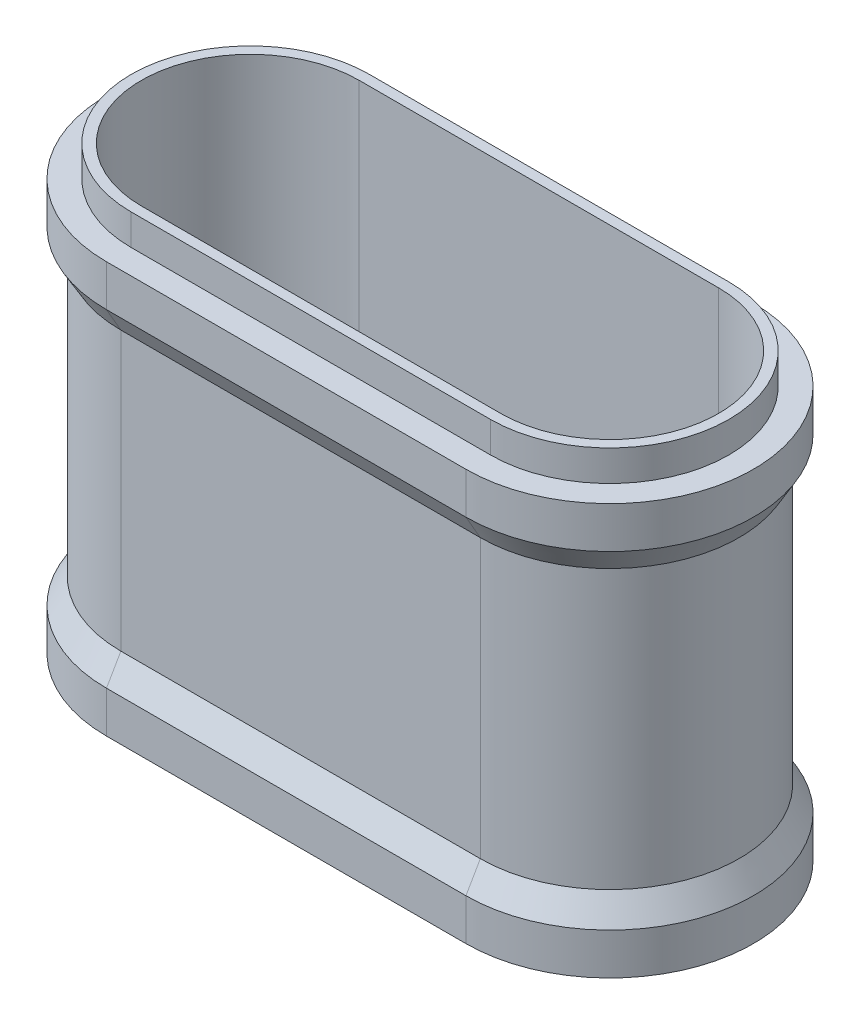
ISO-10303-21;
HEADER;
FILE_DESCRIPTION(('STEP AP214'),'2;1');
FILE_NAME('part.step','',(''),(''),'','','');
FILE_SCHEMA(('AUTOMOTIVE_DESIGN { 1 0 10303 214 1 1 1 1 }'));
ENDSEC;
DATA;
#1=APPLICATION_CONTEXT('core data for automotive mechanical design processes');
#2=APPLICATION_PROTOCOL_DEFINITION('international standard','automotive_design',2000,#1);
#3=PRODUCT_CONTEXT('',#1,'mechanical');
#4=PRODUCT('Part','Part','',(#3));
#5=PRODUCT_RELATED_PRODUCT_CATEGORY('part','',(#4));
#6=PRODUCT_DEFINITION_FORMATION('','',#4);
#7=PRODUCT_DEFINITION_CONTEXT('part definition',#1,'design');
#8=PRODUCT_DEFINITION('design','',#6,#7);
#9=PRODUCT_DEFINITION_SHAPE('','',#8);
#10=(LENGTH_UNIT() NAMED_UNIT(*) SI_UNIT(.MILLI.,.METRE.));
#11=(NAMED_UNIT(*) PLANE_ANGLE_UNIT() SI_UNIT($,.RADIAN.));
#12=(NAMED_UNIT(*) SI_UNIT($,.STERADIAN.) SOLID_ANGLE_UNIT());
#13=UNCERTAINTY_MEASURE_WITH_UNIT(LENGTH_MEASURE(1.E-05),#10,'distance_accuracy_value','');
#14=(GEOMETRIC_REPRESENTATION_CONTEXT(3) GLOBAL_UNCERTAINTY_ASSIGNED_CONTEXT((#13)) GLOBAL_UNIT_ASSIGNED_CONTEXT((#10,
#11,#12)) REPRESENTATION_CONTEXT('',''));
#15=CARTESIAN_POINT('',(0.,0.,0.));
#16=DIRECTION('',(0.,0.,1.));
#17=DIRECTION('',(1.,0.,0.));
#18=AXIS2_PLACEMENT_3D('',#15,#16,#17);
#19=CARTESIAN_POINT('',(-8.75,10.,0.));
#20=DIRECTION('',(0.,1.,0.));
#21=DIRECTION('',(0.,0.,1.));
#22=AXIS2_PLACEMENT_3D('',#19,#20,#21);
#23=PLANE('',#22);
#24=CARTESIAN_POINT('',(8.75,10.,0.));
#25=DIRECTION('',(0.,1.,0.));
#26=DIRECTION('',(0.,0.,1.));
#27=AXIS2_PLACEMENT_3D('',#24,#25,#26);
#28=CIRCLE('',#27,7.);
#29=CARTESIAN_POINT('',(8.75,10.,7.));
#30=VERTEX_POINT('',#29);
#31=CARTESIAN_POINT('',(8.75,10.,-7.));
#32=VERTEX_POINT('',#31);
#33=EDGE_CURVE('E257',#30,#32,#28,.T.);
#34=ORIENTED_EDGE('',*,*,#33,.T.);
#35=DIRECTION('',(-1.,0.,0.));
#36=VECTOR('',#35,1.);
#37=CARTESIAN_POINT('',(8.75,10.,-7.));
#38=LINE('',#37,#36);
#39=CARTESIAN_POINT('',(-8.75,10.,-7.));
#40=VERTEX_POINT('',#39);
#41=EDGE_CURVE('E268',#32,#40,#38,.T.);
#42=ORIENTED_EDGE('',*,*,#41,.T.);
#43=CARTESIAN_POINT('',(-8.75,10.,0.));
#44=DIRECTION('',(0.,1.,0.));
#45=DIRECTION('',(0.,0.,1.));
#46=AXIS2_PLACEMENT_3D('',#43,#44,#45);
#47=CIRCLE('',#46,7.);
#48=CARTESIAN_POINT('',(-8.75,10.,7.));
#49=VERTEX_POINT('',#48);
#50=EDGE_CURVE('E271',#40,#49,#47,.T.);
#51=ORIENTED_EDGE('',*,*,#50,.T.);
#52=DIRECTION('',(1.,0.,0.));
#53=VECTOR('',#52,1.);
#54=CARTESIAN_POINT('',(8.75,10.,7.));
#55=LINE('',#54,#53);
#56=EDGE_CURVE('E274',#49,#30,#55,.T.);
#57=ORIENTED_EDGE('',*,*,#56,.T.);
#58=EDGE_LOOP('',(#34,#42,#51,#57));
#59=FACE_BOUND('',#58,.T.);
#60=DIRECTION('',(1.,0.,0.));
#61=VECTOR('',#60,1.);
#62=CARTESIAN_POINT('',(-8.75,10.,5.8));
#63=LINE('',#62,#61);
#64=CARTESIAN_POINT('',(-8.75,10.,5.8));
#65=VERTEX_POINT('',#64);
#66=CARTESIAN_POINT('',(8.75,10.,5.8));
#67=VERTEX_POINT('',#66);
#68=EDGE_CURVE('E229',#65,#67,#63,.T.);
#69=ORIENTED_EDGE('',*,*,#68,.F.);
#70=CARTESIAN_POINT('',(-8.75,10.,0.));
#71=DIRECTION('',(0.,1.,0.));
#72=DIRECTION('',(0.,0.,1.));
#73=AXIS2_PLACEMENT_3D('',#70,#71,#72);
#74=CIRCLE('',#73,5.8);
#75=CARTESIAN_POINT('',(-8.75,10.,-5.8));
#76=VERTEX_POINT('',#75);
#77=EDGE_CURVE('E215',#76,#65,#74,.T.);
#78=ORIENTED_EDGE('',*,*,#77,.F.);
#79=DIRECTION('',(-1.,0.,0.));
#80=VECTOR('',#79,1.);
#81=CARTESIAN_POINT('',(8.74999999999999,10.,-5.8));
#82=LINE('',#81,#80);
#83=CARTESIAN_POINT('',(8.74999999999999,10.,-5.8));
#84=VERTEX_POINT('',#83);
#85=EDGE_CURVE('E220',#84,#76,#82,.T.);
#86=ORIENTED_EDGE('',*,*,#85,.F.);
#87=CARTESIAN_POINT('',(8.75,10.,0.));
#88=DIRECTION('',(0.,1.,0.));
#89=DIRECTION('',(0.,0.,1.));
#90=AXIS2_PLACEMENT_3D('',#87,#88,#89);
#91=CIRCLE('',#90,5.8);
#92=EDGE_CURVE('E231',#67,#84,#91,.T.);
#93=ORIENTED_EDGE('',*,*,#92,.F.);
#94=EDGE_LOOP('',(#69,#78,#86,#93));
#95=FACE_BOUND('',#94,.T.);
#96=ADVANCED_FACE('F45',(#59,#95),#23,.T.);
#97=CARTESIAN_POINT('',(-8.75,-10.,0.));
#98=DIRECTION('',(0.,1.,0.));
#99=DIRECTION('',(0.,0.,1.));
#100=AXIS2_PLACEMENT_3D('',#97,#98,#99);
#101=CYLINDRICAL_SURFACE('',#100,6.3);
#102=DIRECTION('',(0.,1.,0.));
#103=VECTOR('',#102,1.);
#104=CARTESIAN_POINT('',(-8.75,-10.,-6.3));
#105=LINE('',#104,#103);
#106=CARTESIAN_POINT('',(-8.75,-6.76794919243109,-6.3));
#107=VERTEX_POINT('',#106);
#108=CARTESIAN_POINT('',(-8.75,6.76794919243109,-6.3));
#109=VERTEX_POINT('',#108);
#110=EDGE_CURVE('E297',#107,#109,#105,.T.);
#111=ORIENTED_EDGE('',*,*,#110,.F.);
#112=CARTESIAN_POINT('',(-8.75,-6.76794919243109,0.));
#113=DIRECTION('',(0.,-1.,0.));
#114=DIRECTION('',(0.,0.,-1.));
#115=AXIS2_PLACEMENT_3D('',#112,#113,#114);
#116=CIRCLE('',#115,6.3);
#117=CARTESIAN_POINT('',(-8.75,-6.76794919243109,6.3));
#118=VERTEX_POINT('',#117);
#119=EDGE_CURVE('E324',#107,#118,#116,.F.);
#120=ORIENTED_EDGE('',*,*,#119,.T.);
#121=DIRECTION('',(0.,1.,0.));
#122=VECTOR('',#121,1.);
#123=CARTESIAN_POINT('',(-8.75,-10.,6.3));
#124=LINE('',#123,#122);
#125=CARTESIAN_POINT('',(-8.75,6.76794919243109,6.3));
#126=VERTEX_POINT('',#125);
#127=EDGE_CURVE('E293',#118,#126,#124,.T.);
#128=ORIENTED_EDGE('',*,*,#127,.T.);
#129=CARTESIAN_POINT('',(-8.75,6.76794919243109,0.));
#130=DIRECTION('',(0.,1.,0.));
#131=DIRECTION('',(0.,0.,1.));
#132=AXIS2_PLACEMENT_3D('',#129,#130,#131);
#133=CIRCLE('',#132,6.3);
#134=EDGE_CURVE('E322',#126,#109,#133,.F.);
#135=ORIENTED_EDGE('',*,*,#134,.T.);
#136=EDGE_LOOP('',(#111,#120,#128,#135));
#137=FACE_BOUND('',#136,.T.);
#138=ADVANCED_FACE('F409',(#137),#101,.T.);
#139=CARTESIAN_POINT('',(-8.75,-10.,-6.3));
#140=DIRECTION('',(0.,0.,-1.));
#141=DIRECTION('',(-1.,0.,0.));
#142=AXIS2_PLACEMENT_3D('',#139,#140,#141);
#143=PLANE('',#142);
#144=DIRECTION('',(0.,1.,0.));
#145=VECTOR('',#144,1.);
#146=CARTESIAN_POINT('',(8.75,-10.,-6.3));
#147=LINE('',#146,#145);
#148=CARTESIAN_POINT('',(8.75,-6.76794919243109,-6.3));
#149=VERTEX_POINT('',#148);
#150=CARTESIAN_POINT('',(8.75,6.76794919243109,-6.3));
#151=VERTEX_POINT('',#150);
#152=EDGE_CURVE('E301',#149,#151,#147,.T.);
#153=ORIENTED_EDGE('',*,*,#152,.F.);
#154=DIRECTION('',(-1.,0.,0.));
#155=VECTOR('',#154,1.);
#156=CARTESIAN_POINT('',(-8.75,-6.76794919243109,-6.3));
#157=LINE('',#156,#155);
#158=EDGE_CURVE('E316',#149,#107,#157,.T.);
#159=ORIENTED_EDGE('',*,*,#158,.T.);
#160=ORIENTED_EDGE('',*,*,#110,.T.);
#161=DIRECTION('',(1.,0.,0.));
#162=VECTOR('',#161,1.);
#163=CARTESIAN_POINT('',(-8.75,6.76794919243109,-6.3));
#164=LINE('',#163,#162);
#165=EDGE_CURVE('E313',#109,#151,#164,.T.);
#166=ORIENTED_EDGE('',*,*,#165,.T.);
#167=EDGE_LOOP('',(#153,#159,#160,#166));
#168=FACE_BOUND('',#167,.T.);
#169=ADVANCED_FACE('F390',(#168),#143,.T.);
#170=CARTESIAN_POINT('',(8.75,-10.,0.));
#171=DIRECTION('',(0.,1.,0.));
#172=DIRECTION('',(0.,0.,1.));
#173=AXIS2_PLACEMENT_3D('',#170,#171,#172);
#174=CYLINDRICAL_SURFACE('',#173,6.3);
#175=DIRECTION('',(0.,1.,0.));
#176=VECTOR('',#175,1.);
#177=CARTESIAN_POINT('',(8.75,-10.,6.29999999999999));
#178=LINE('',#177,#176);
#179=CARTESIAN_POINT('',(8.75,-6.76794919243109,6.29999999999999));
#180=VERTEX_POINT('',#179);
#181=CARTESIAN_POINT('',(8.75,6.76794919243109,6.29999999999999));
#182=VERTEX_POINT('',#181);
#183=EDGE_CURVE('E304',#180,#182,#178,.T.);
#184=ORIENTED_EDGE('',*,*,#183,.F.);
#185=CARTESIAN_POINT('',(8.75,-6.76794919243109,0.));
#186=DIRECTION('',(0.,-1.,0.));
#187=DIRECTION('',(0.,0.,-1.));
#188=AXIS2_PLACEMENT_3D('',#185,#186,#187);
#189=CIRCLE('',#188,6.3);
#190=EDGE_CURVE('E310',#180,#149,#189,.F.);
#191=ORIENTED_EDGE('',*,*,#190,.T.);
#192=ORIENTED_EDGE('',*,*,#152,.T.);
#193=CARTESIAN_POINT('',(8.75,6.76794919243109,0.));
#194=DIRECTION('',(0.,1.,0.));
#195=DIRECTION('',(0.,0.,1.));
#196=AXIS2_PLACEMENT_3D('',#193,#194,#195);
#197=CIRCLE('',#196,6.3);
#198=EDGE_CURVE('E300',#151,#182,#197,.F.);
#199=ORIENTED_EDGE('',*,*,#198,.T.);
#200=EDGE_LOOP('',(#184,#191,#192,#199));
#201=FACE_BOUND('',#200,.T.);
#202=ADVANCED_FACE('F394',(#201),#174,.T.);
#203=CARTESIAN_POINT('',(-8.75,-10.,6.3));
#204=DIRECTION('',(0.,0.,1.));
#205=DIRECTION('',(1.,0.,0.));
#206=AXIS2_PLACEMENT_3D('',#203,#204,#205);
#207=PLANE('',#206);
#208=ORIENTED_EDGE('',*,*,#127,.F.);
#209=DIRECTION('',(1.,0.,0.));
#210=VECTOR('',#209,1.);
#211=CARTESIAN_POINT('',(-8.75,-6.76794919243109,6.3));
#212=LINE('',#211,#210);
#213=EDGE_CURVE('E320',#118,#180,#212,.T.);
#214=ORIENTED_EDGE('',*,*,#213,.T.);
#215=ORIENTED_EDGE('',*,*,#183,.T.);
#216=DIRECTION('',(-1.,0.,0.));
#217=VECTOR('',#216,1.);
#218=CARTESIAN_POINT('',(-8.75,6.76794919243109,6.3));
#219=LINE('',#218,#217);
#220=EDGE_CURVE('E318',#182,#126,#219,.T.);
#221=ORIENTED_EDGE('',*,*,#220,.T.);
#222=EDGE_LOOP('',(#208,#214,#215,#221));
#223=FACE_BOUND('',#222,.T.);
#224=ADVANCED_FACE('F419',(#223),#207,.T.);
#225=CARTESIAN_POINT('',(-8.75,-10.,0.));
#226=DIRECTION('',(0.,1.,0.));
#227=DIRECTION('',(0.,0.,1.));
#228=AXIS2_PLACEMENT_3D('',#225,#226,#227);
#229=PLANE('',#228);
#230=DIRECTION('',(-1.,0.,0.));
#231=VECTOR('',#230,1.);
#232=CARTESIAN_POINT('',(-8.75,-10.,-5.3));
#233=LINE('',#232,#231);
#234=CARTESIAN_POINT('',(8.75,-10.,-5.3));
#235=VERTEX_POINT('',#234);
#236=CARTESIAN_POINT('',(-8.75,-10.,-5.3));
#237=VERTEX_POINT('',#236);
#238=EDGE_CURVE('E192',#235,#237,#233,.T.);
#239=ORIENTED_EDGE('',*,*,#238,.T.);
#240=CARTESIAN_POINT('',(-8.75,-10.,0.));
#241=DIRECTION('',(0.,1.,0.));
#242=DIRECTION('',(0.,0.,1.));
#243=AXIS2_PLACEMENT_3D('',#240,#241,#242);
#244=CIRCLE('',#243,5.3);
#245=CARTESIAN_POINT('',(-8.75,-10.,5.3));
#246=VERTEX_POINT('',#245);
#247=EDGE_CURVE('E279',#237,#246,#244,.T.);
#248=ORIENTED_EDGE('',*,*,#247,.T.);
#249=DIRECTION('',(1.,0.,0.));
#250=VECTOR('',#249,1.);
#251=CARTESIAN_POINT('',(-8.75,-10.,5.3));
#252=LINE('',#251,#250);
#253=CARTESIAN_POINT('',(8.75,-10.,5.3));
#254=VERTEX_POINT('',#253);
#255=EDGE_CURVE('E286',#246,#254,#252,.T.);
#256=ORIENTED_EDGE('',*,*,#255,.T.);
#257=CARTESIAN_POINT('',(8.75,-10.,0.));
#258=DIRECTION('',(0.,1.,0.));
#259=DIRECTION('',(0.,0.,1.));
#260=AXIS2_PLACEMENT_3D('',#257,#258,#259);
#261=CIRCLE('',#260,5.3);
#262=EDGE_CURVE('E289',#254,#235,#261,.T.);
#263=ORIENTED_EDGE('',*,*,#262,.T.);
#264=EDGE_LOOP('',(#239,#248,#256,#263));
#265=FACE_BOUND('',#264,.T.);
#266=CARTESIAN_POINT('',(8.75,-10.,0.));
#267=DIRECTION('',(0.,1.,0.));
#268=DIRECTION('',(0.,0.,1.));
#269=AXIS2_PLACEMENT_3D('',#266,#267,#268);
#270=CIRCLE('',#269,7.);
#271=CARTESIAN_POINT('',(8.75,-10.,7.));
#272=VERTEX_POINT('',#271);
#273=CARTESIAN_POINT('',(8.75,-10.,-7.));
#274=VERTEX_POINT('',#273);
#275=EDGE_CURVE('E244',#272,#274,#270,.T.);
#276=ORIENTED_EDGE('',*,*,#275,.F.);
#277=DIRECTION('',(1.,0.,0.));
#278=VECTOR('',#277,1.);
#279=CARTESIAN_POINT('',(8.75,-10.,7.));
#280=LINE('',#279,#278);
#281=CARTESIAN_POINT('',(-8.75,-10.,7.));
#282=VERTEX_POINT('',#281);
#283=EDGE_CURVE('E247',#282,#272,#280,.T.);
#284=ORIENTED_EDGE('',*,*,#283,.F.);
#285=CARTESIAN_POINT('',(-8.75,-10.,0.));
#286=DIRECTION('',(0.,1.,0.));
#287=DIRECTION('',(0.,0.,1.));
#288=AXIS2_PLACEMENT_3D('',#285,#286,#287);
#289=CIRCLE('',#288,7.);
#290=CARTESIAN_POINT('',(-8.75,-10.,-7.));
#291=VERTEX_POINT('',#290);
#292=EDGE_CURVE('E249',#291,#282,#289,.T.);
#293=ORIENTED_EDGE('',*,*,#292,.F.);
#294=DIRECTION('',(-1.,0.,0.));
#295=VECTOR('',#294,1.);
#296=CARTESIAN_POINT('',(8.75,-10.,-7.));
#297=LINE('',#296,#295);
#298=EDGE_CURVE('E251',#274,#291,#297,.T.);
#299=ORIENTED_EDGE('',*,*,#298,.F.);
#300=EDGE_LOOP('',(#276,#284,#293,#299));
#301=FACE_BOUND('',#300,.T.);
#302=ADVANCED_FACE('F421',(#265,#301),#229,.F.);
#303=CARTESIAN_POINT('',(-8.75,-10.,0.));
#304=DIRECTION('',(0.,1.,0.));
#305=DIRECTION('',(0.,0.,1.));
#306=AXIS2_PLACEMENT_3D('',#303,#304,#305);
#307=CYLINDRICAL_SURFACE('',#306,5.3);
#308=DIRECTION('',(0.,1.,0.));
#309=VECTOR('',#308,1.);
#310=CARTESIAN_POINT('',(-8.75,-10.,-5.3));
#311=LINE('',#310,#309);
#312=CARTESIAN_POINT('',(-8.75,11.5,-5.3));
#313=VERTEX_POINT('',#312);
#314=EDGE_CURVE('E195',#237,#313,#311,.T.);
#315=ORIENTED_EDGE('',*,*,#314,.T.);
#316=CARTESIAN_POINT('',(-8.75,11.5,0.));
#317=DIRECTION('',(0.,1.,0.));
#318=DIRECTION('',(0.,0.,1.));
#319=AXIS2_PLACEMENT_3D('',#316,#317,#318);
#320=CIRCLE('',#319,5.3);
#321=CARTESIAN_POINT('',(-8.75,11.5,5.3));
#322=VERTEX_POINT('',#321);
#323=EDGE_CURVE('E209',#313,#322,#320,.T.);
#324=ORIENTED_EDGE('',*,*,#323,.T.);
#325=DIRECTION('',(0.,1.,0.));
#326=VECTOR('',#325,1.);
#327=CARTESIAN_POINT('',(-8.75,-10.,5.3));
#328=LINE('',#327,#326);
#329=EDGE_CURVE('E292',#246,#322,#328,.T.);
#330=ORIENTED_EDGE('',*,*,#329,.F.);
#331=ORIENTED_EDGE('',*,*,#247,.F.);
#332=EDGE_LOOP('',(#315,#324,#330,#331));
#333=FACE_BOUND('',#332,.T.);
#334=ADVANCED_FACE('F428',(#333),#307,.F.);
#335=CARTESIAN_POINT('',(-8.75,-10.,-5.3));
#336=DIRECTION('',(0.,0.,-1.));
#337=DIRECTION('',(-1.,0.,0.));
#338=AXIS2_PLACEMENT_3D('',#335,#336,#337);
#339=PLANE('',#338);
#340=DIRECTION('',(0.,1.,0.));
#341=VECTOR('',#340,1.);
#342=CARTESIAN_POINT('',(8.75,-10.,-5.3));
#343=LINE('',#342,#341);
#344=CARTESIAN_POINT('',(8.74999999999999,11.5,-5.3));
#345=VERTEX_POINT('',#344);
#346=EDGE_CURVE('E185',#235,#345,#343,.T.);
#347=ORIENTED_EDGE('',*,*,#346,.T.);
#348=DIRECTION('',(-1.,0.,0.));
#349=VECTOR('',#348,1.);
#350=CARTESIAN_POINT('',(8.74999999999999,11.5,-5.3));
#351=LINE('',#350,#349);
#352=EDGE_CURVE('E189',#345,#313,#351,.T.);
#353=ORIENTED_EDGE('',*,*,#352,.T.);
#354=ORIENTED_EDGE('',*,*,#314,.F.);
#355=ORIENTED_EDGE('',*,*,#238,.F.);
#356=EDGE_LOOP('',(#347,#353,#354,#355));
#357=FACE_BOUND('',#356,.T.);
#358=ADVANCED_FACE('F187',(#357),#339,.F.);
#359=CARTESIAN_POINT('',(8.75,-10.,0.));
#360=DIRECTION('',(0.,1.,0.));
#361=DIRECTION('',(0.,0.,1.));
#362=AXIS2_PLACEMENT_3D('',#359,#360,#361);
#363=CYLINDRICAL_SURFACE('',#362,5.3);
#364=DIRECTION('',(0.,1.,0.));
#365=VECTOR('',#364,1.);
#366=CARTESIAN_POINT('',(8.75,-10.,5.3));
#367=LINE('',#366,#365);
#368=CARTESIAN_POINT('',(8.75,11.5,5.3));
#369=VERTEX_POINT('',#368);
#370=EDGE_CURVE('E196',#254,#369,#367,.T.);
#371=ORIENTED_EDGE('',*,*,#370,.T.);
#372=CARTESIAN_POINT('',(8.75,11.5,0.));
#373=DIRECTION('',(0.,1.,0.));
#374=DIRECTION('',(0.,0.,1.));
#375=AXIS2_PLACEMENT_3D('',#372,#373,#374);
#376=CIRCLE('',#375,5.3);
#377=EDGE_CURVE('E199',#369,#345,#376,.T.);
#378=ORIENTED_EDGE('',*,*,#377,.T.);
#379=ORIENTED_EDGE('',*,*,#346,.F.);
#380=ORIENTED_EDGE('',*,*,#262,.F.);
#381=EDGE_LOOP('',(#371,#378,#379,#380));
#382=FACE_BOUND('',#381,.T.);
#383=ADVANCED_FACE('F200',(#382),#363,.F.);
#384=CARTESIAN_POINT('',(-8.75,-10.,5.3));
#385=DIRECTION('',(0.,0.,1.));
#386=DIRECTION('',(1.,0.,0.));
#387=AXIS2_PLACEMENT_3D('',#384,#385,#386);
#388=PLANE('',#387);
#389=ORIENTED_EDGE('',*,*,#329,.T.);
#390=DIRECTION('',(1.,0.,0.));
#391=VECTOR('',#390,1.);
#392=CARTESIAN_POINT('',(-8.75,11.5,5.3));
#393=LINE('',#392,#391);
#394=EDGE_CURVE('E211',#322,#369,#393,.T.);
#395=ORIENTED_EDGE('',*,*,#394,.T.);
#396=ORIENTED_EDGE('',*,*,#370,.F.);
#397=ORIENTED_EDGE('',*,*,#255,.F.);
#398=EDGE_LOOP('',(#389,#395,#396,#397));
#399=FACE_BOUND('',#398,.T.);
#400=ADVANCED_FACE('F446',(#399),#388,.F.);
#401=CARTESIAN_POINT('',(8.75,8.5,0.));
#402=DIRECTION('',(0.,1.,0.));
#403=DIRECTION('',(0.,0.,1.));
#404=AXIS2_PLACEMENT_3D('',#401,#402,#403);
#405=CYLINDRICAL_SURFACE('',#404,7.);
#406=ORIENTED_EDGE('',*,*,#33,.F.);
#407=DIRECTION('',(0.,1.,0.));
#408=VECTOR('',#407,1.);
#409=CARTESIAN_POINT('',(8.75,8.5,7.));
#410=LINE('',#409,#408);
#411=CARTESIAN_POINT('',(8.75,7.98038475772931,6.99999999999999));
#412=VERTEX_POINT('',#411);
#413=EDGE_CURVE('E63',#412,#30,#410,.T.);
#414=ORIENTED_EDGE('',*,*,#413,.F.);
#415=CARTESIAN_POINT('',(8.75,7.98038475772931,0.));
#416=DIRECTION('',(0.,1.,0.));
#417=DIRECTION('',(0.,0.,1.));
#418=AXIS2_PLACEMENT_3D('',#415,#416,#417);
#419=CIRCLE('',#418,7.);
#420=CARTESIAN_POINT('',(8.75,7.98038475772931,-7.));
#421=VERTEX_POINT('',#420);
#422=EDGE_CURVE('E341',#412,#421,#419,.T.);
#423=ORIENTED_EDGE('',*,*,#422,.T.);
#424=DIRECTION('',(0.,1.,0.));
#425=VECTOR('',#424,1.);
#426=CARTESIAN_POINT('',(8.75,8.5,-7.));
#427=LINE('',#426,#425);
#428=EDGE_CURVE('E277',#421,#32,#427,.T.);
#429=ORIENTED_EDGE('',*,*,#428,.T.);
#430=EDGE_LOOP('',(#406,#414,#423,#429));
#431=FACE_BOUND('',#430,.T.);
#432=ADVANCED_FACE('F375',(#431),#405,.T.);
#433=CARTESIAN_POINT('',(8.75,8.5,7.));
#434=DIRECTION('',(0.,0.,1.));
#435=DIRECTION('',(1.,0.,0.));
#436=AXIS2_PLACEMENT_3D('',#433,#434,#435);
#437=PLANE('',#436);
#438=ORIENTED_EDGE('',*,*,#56,.F.);
#439=DIRECTION('',(0.,1.,0.));
#440=VECTOR('',#439,1.);
#441=CARTESIAN_POINT('',(-8.75,8.5,7.));
#442=LINE('',#441,#440);
#443=CARTESIAN_POINT('',(-8.75,7.98038475772932,7.));
#444=VERTEX_POINT('',#443);
#445=EDGE_CURVE('E69',#444,#49,#442,.T.);
#446=ORIENTED_EDGE('',*,*,#445,.F.);
#447=DIRECTION('',(1.,0.,0.));
#448=VECTOR('',#447,1.);
#449=CARTESIAN_POINT('',(-8.75,7.98038475772932,7.));
#450=LINE('',#449,#448);
#451=EDGE_CURVE('E11',#444,#412,#450,.T.);
#452=ORIENTED_EDGE('',*,*,#451,.T.);
#453=ORIENTED_EDGE('',*,*,#413,.T.);
#454=EDGE_LOOP('',(#438,#446,#452,#453));
#455=FACE_BOUND('',#454,.T.);
#456=ADVANCED_FACE('F374',(#455),#437,.T.);
#457=CARTESIAN_POINT('',(-8.75,8.5,0.));
#458=DIRECTION('',(0.,1.,0.));
#459=DIRECTION('',(0.,0.,1.));
#460=AXIS2_PLACEMENT_3D('',#457,#458,#459);
#461=CYLINDRICAL_SURFACE('',#460,7.);
#462=ORIENTED_EDGE('',*,*,#50,.F.);
#463=DIRECTION('',(0.,1.,0.));
#464=VECTOR('',#463,1.);
#465=CARTESIAN_POINT('',(-8.75,8.5,-7.));
#466=LINE('',#465,#464);
#467=CARTESIAN_POINT('',(-8.75,7.98038475772931,-7.));
#468=VERTEX_POINT('',#467);
#469=EDGE_CURVE('E281',#468,#40,#466,.T.);
#470=ORIENTED_EDGE('',*,*,#469,.F.);
#471=CARTESIAN_POINT('',(-8.75,7.98038475772931,0.));
#472=DIRECTION('',(0.,1.,0.));
#473=DIRECTION('',(0.,0.,1.));
#474=AXIS2_PLACEMENT_3D('',#471,#472,#473);
#475=CIRCLE('',#474,7.);
#476=EDGE_CURVE('E55',#468,#444,#475,.T.);
#477=ORIENTED_EDGE('',*,*,#476,.T.);
#478=ORIENTED_EDGE('',*,*,#445,.T.);
#479=EDGE_LOOP('',(#462,#470,#477,#478));
#480=FACE_BOUND('',#479,.T.);
#481=ADVANCED_FACE('F381',(#480),#461,.T.);
#482=CARTESIAN_POINT('',(8.75,8.5,-7.));
#483=DIRECTION('',(0.,0.,-1.));
#484=DIRECTION('',(-1.,0.,0.));
#485=AXIS2_PLACEMENT_3D('',#482,#483,#484);
#486=PLANE('',#485);
#487=ORIENTED_EDGE('',*,*,#428,.F.);
#488=DIRECTION('',(-1.,0.,0.));
#489=VECTOR('',#488,1.);
#490=CARTESIAN_POINT('',(-8.75,7.98038475772931,-7.));
#491=LINE('',#490,#489);
#492=EDGE_CURVE('E338',#421,#468,#491,.T.);
#493=ORIENTED_EDGE('',*,*,#492,.T.);
#494=ORIENTED_EDGE('',*,*,#469,.T.);
#495=ORIENTED_EDGE('',*,*,#41,.F.);
#496=EDGE_LOOP('',(#487,#493,#494,#495));
#497=FACE_BOUND('',#496,.T.);
#498=ADVANCED_FACE('F473',(#497),#486,.T.);
#499=CARTESIAN_POINT('',(8.75,-8.5,0.));
#500=DIRECTION('',(0.,-1.,0.));
#501=DIRECTION('',(0.,0.,-1.));
#502=AXIS2_PLACEMENT_3D('',#499,#500,#501);
#503=CYLINDRICAL_SURFACE('',#502,7.);
#504=ORIENTED_EDGE('',*,*,#275,.T.);
#505=DIRECTION('',(0.,-1.,0.));
#506=VECTOR('',#505,1.);
#507=CARTESIAN_POINT('',(8.75,-8.5,-7.));
#508=LINE('',#507,#506);
#509=CARTESIAN_POINT('',(8.74999999999999,-7.98038475772932,-7.00000000000001));
#510=VERTEX_POINT('',#509);
#511=EDGE_CURVE('E254',#510,#274,#508,.T.);
#512=ORIENTED_EDGE('',*,*,#511,.F.);
#513=CARTESIAN_POINT('',(8.75,-7.98038475772931,0.));
#514=DIRECTION('',(0.,-1.,0.));
#515=DIRECTION('',(0.,0.,-1.));
#516=AXIS2_PLACEMENT_3D('',#513,#514,#515);
#517=CIRCLE('',#516,7.);
#518=CARTESIAN_POINT('',(8.75,-7.98038475772931,7.));
#519=VERTEX_POINT('',#518);
#520=EDGE_CURVE('E326',#510,#519,#517,.T.);
#521=ORIENTED_EDGE('',*,*,#520,.T.);
#522=DIRECTION('',(0.,-1.,0.));
#523=VECTOR('',#522,1.);
#524=CARTESIAN_POINT('',(8.75,-8.5,7.));
#525=LINE('',#524,#523);
#526=EDGE_CURVE('E253',#519,#272,#525,.T.);
#527=ORIENTED_EDGE('',*,*,#526,.T.);
#528=EDGE_LOOP('',(#504,#512,#521,#527));
#529=FACE_BOUND('',#528,.T.);
#530=ADVANCED_FACE('F478',(#529),#503,.T.);
#531=CARTESIAN_POINT('',(8.75,-8.5,-7.));
#532=DIRECTION('',(0.,0.,1.));
#533=DIRECTION('',(1.,0.,0.));
#534=AXIS2_PLACEMENT_3D('',#531,#532,#533);
#535=PLANE('',#534);
#536=ORIENTED_EDGE('',*,*,#298,.T.);
#537=DIRECTION('',(0.,-1.,0.));
#538=VECTOR('',#537,1.);
#539=CARTESIAN_POINT('',(-8.75,-8.5,-7.));
#540=LINE('',#539,#538);
#541=CARTESIAN_POINT('',(-8.75,-7.98038475772931,-7.));
#542=VERTEX_POINT('',#541);
#543=EDGE_CURVE('E258',#542,#291,#540,.T.);
#544=ORIENTED_EDGE('',*,*,#543,.F.);
#545=DIRECTION('',(1.,0.,0.));
#546=VECTOR('',#545,1.);
#547=CARTESIAN_POINT('',(8.75,-7.98038475772932,-7.));
#548=LINE('',#547,#546);
#549=EDGE_CURVE('E329',#542,#510,#548,.T.);
#550=ORIENTED_EDGE('',*,*,#549,.T.);
#551=ORIENTED_EDGE('',*,*,#511,.T.);
#552=EDGE_LOOP('',(#536,#544,#550,#551));
#553=FACE_BOUND('',#552,.T.);
#554=ADVANCED_FACE('F554',(#553),#535,.F.);
#555=CARTESIAN_POINT('',(-8.75,-8.5,0.));
#556=DIRECTION('',(0.,-1.,0.));
#557=DIRECTION('',(0.,0.,-1.));
#558=AXIS2_PLACEMENT_3D('',#555,#556,#557);
#559=CYLINDRICAL_SURFACE('',#558,7.);
#560=ORIENTED_EDGE('',*,*,#292,.T.);
#561=DIRECTION('',(0.,-1.,0.));
#562=VECTOR('',#561,1.);
#563=CARTESIAN_POINT('',(-8.75,-8.5,7.));
#564=LINE('',#563,#562);
#565=CARTESIAN_POINT('',(-8.75,-7.98038475772931,7.));
#566=VERTEX_POINT('',#565);
#567=EDGE_CURVE('E261',#566,#282,#564,.T.);
#568=ORIENTED_EDGE('',*,*,#567,.F.);
#569=CARTESIAN_POINT('',(-8.75,-7.98038475772931,0.));
#570=DIRECTION('',(0.,-1.,0.));
#571=DIRECTION('',(0.,0.,-1.));
#572=AXIS2_PLACEMENT_3D('',#569,#570,#571);
#573=CIRCLE('',#572,7.);
#574=EDGE_CURVE('E335',#566,#542,#573,.T.);
#575=ORIENTED_EDGE('',*,*,#574,.T.);
#576=ORIENTED_EDGE('',*,*,#543,.T.);
#577=EDGE_LOOP('',(#560,#568,#575,#576));
#578=FACE_BOUND('',#577,.T.);
#579=ADVANCED_FACE('F564',(#578),#559,.T.);
#580=CARTESIAN_POINT('',(8.75,-8.5,7.));
#581=DIRECTION('',(0.,0.,-1.));
#582=DIRECTION('',(-1.,0.,0.));
#583=AXIS2_PLACEMENT_3D('',#580,#581,#582);
#584=PLANE('',#583);
#585=ORIENTED_EDGE('',*,*,#283,.T.);
#586=ORIENTED_EDGE('',*,*,#526,.F.);
#587=DIRECTION('',(-1.,0.,0.));
#588=VECTOR('',#587,1.);
#589=CARTESIAN_POINT('',(8.75,-7.98038475772931,7.));
#590=LINE('',#589,#588);
#591=EDGE_CURVE('E332',#519,#566,#590,.T.);
#592=ORIENTED_EDGE('',*,*,#591,.T.);
#593=ORIENTED_EDGE('',*,*,#567,.T.);
#594=EDGE_LOOP('',(#585,#586,#592,#593));
#595=FACE_BOUND('',#594,.T.);
#596=ADVANCED_FACE('F574',(#595),#584,.F.);
#597=CARTESIAN_POINT('',(-8.75,11.5,0.));
#598=DIRECTION('',(0.,1.,0.));
#599=DIRECTION('',(0.,0.,1.));
#600=AXIS2_PLACEMENT_3D('',#597,#598,#599);
#601=PLANE('',#600);
#602=CARTESIAN_POINT('',(-8.75,11.5,0.));
#603=DIRECTION('',(0.,1.,0.));
#604=DIRECTION('',(0.,0.,1.));
#605=AXIS2_PLACEMENT_3D('',#602,#603,#604);
#606=CIRCLE('',#605,5.8);
#607=CARTESIAN_POINT('',(-8.75,11.5,-5.8));
#608=VERTEX_POINT('',#607);
#609=CARTESIAN_POINT('',(-8.75,11.5,5.8));
#610=VERTEX_POINT('',#609);
#611=EDGE_CURVE('E216',#608,#610,#606,.T.);
#612=ORIENTED_EDGE('',*,*,#611,.T.);
#613=DIRECTION('',(1.,0.,0.));
#614=VECTOR('',#613,1.);
#615=CARTESIAN_POINT('',(-8.75,11.5,5.8));
#616=LINE('',#615,#614);
#617=CARTESIAN_POINT('',(8.75,11.5,5.8));
#618=VERTEX_POINT('',#617);
#619=EDGE_CURVE('E219',#610,#618,#616,.T.);
#620=ORIENTED_EDGE('',*,*,#619,.T.);
#621=CARTESIAN_POINT('',(8.75,11.5,0.));
#622=DIRECTION('',(0.,1.,0.));
#623=DIRECTION('',(0.,0.,1.));
#624=AXIS2_PLACEMENT_3D('',#621,#622,#623);
#625=CIRCLE('',#624,5.8);
#626=CARTESIAN_POINT('',(8.75,11.5,-5.8));
#627=VERTEX_POINT('',#626);
#628=EDGE_CURVE('E222',#618,#627,#625,.T.);
#629=ORIENTED_EDGE('',*,*,#628,.T.);
#630=DIRECTION('',(-1.,0.,0.));
#631=VECTOR('',#630,1.);
#632=CARTESIAN_POINT('',(8.74999999999999,11.5,-5.8));
#633=LINE('',#632,#631);
#634=EDGE_CURVE('E224',#627,#608,#633,.T.);
#635=ORIENTED_EDGE('',*,*,#634,.T.);
#636=EDGE_LOOP('',(#612,#620,#629,#635));
#637=FACE_BOUND('',#636,.T.);
#638=ORIENTED_EDGE('',*,*,#352,.F.);
#639=ORIENTED_EDGE('',*,*,#377,.F.);
#640=ORIENTED_EDGE('',*,*,#394,.F.);
#641=ORIENTED_EDGE('',*,*,#323,.F.);
#642=EDGE_LOOP('',(#638,#639,#640,#641));
#643=FACE_BOUND('',#642,.T.);
#644=ADVANCED_FACE('F207',(#637,#643),#601,.T.);
#645=CARTESIAN_POINT('',(-8.75,11.5,0.));
#646=DIRECTION('',(0.,-1.,0.));
#647=DIRECTION('',(0.,0.,-1.));
#648=AXIS2_PLACEMENT_3D('',#645,#646,#647);
#649=CYLINDRICAL_SURFACE('',#648,5.8);
#650=ORIENTED_EDGE('',*,*,#77,.T.);
#651=DIRECTION('',(0.,-1.,0.));
#652=VECTOR('',#651,1.);
#653=CARTESIAN_POINT('',(-8.75,11.5,5.8));
#654=LINE('',#653,#652);
#655=EDGE_CURVE('E242',#610,#65,#654,.T.);
#656=ORIENTED_EDGE('',*,*,#655,.F.);
#657=ORIENTED_EDGE('',*,*,#611,.F.);
#658=DIRECTION('',(0.,-1.,0.));
#659=VECTOR('',#658,1.);
#660=CARTESIAN_POINT('',(-8.75,11.5,-5.8));
#661=LINE('',#660,#659);
#662=EDGE_CURVE('E226',#608,#76,#661,.T.);
#663=ORIENTED_EDGE('',*,*,#662,.T.);
#664=EDGE_LOOP('',(#650,#656,#657,#663));
#665=FACE_BOUND('',#664,.T.);
#666=ADVANCED_FACE('F598',(#665),#649,.T.);
#667=CARTESIAN_POINT('',(-8.75,11.5,5.8));
#668=DIRECTION('',(0.,0.,-1.));
#669=DIRECTION('',(-1.,0.,0.));
#670=AXIS2_PLACEMENT_3D('',#667,#668,#669);
#671=PLANE('',#670);
#672=ORIENTED_EDGE('',*,*,#68,.T.);
#673=DIRECTION('',(0.,-1.,0.));
#674=VECTOR('',#673,1.);
#675=CARTESIAN_POINT('',(8.75,11.5,5.8));
#676=LINE('',#675,#674);
#677=EDGE_CURVE('E239',#618,#67,#676,.T.);
#678=ORIENTED_EDGE('',*,*,#677,.F.);
#679=ORIENTED_EDGE('',*,*,#619,.F.);
#680=ORIENTED_EDGE('',*,*,#655,.T.);
#681=EDGE_LOOP('',(#672,#678,#679,#680));
#682=FACE_BOUND('',#681,.T.);
#683=ADVANCED_FACE('F607',(#682),#671,.F.);
#684=CARTESIAN_POINT('',(8.75,11.5,0.));
#685=DIRECTION('',(0.,-1.,0.));
#686=DIRECTION('',(0.,0.,-1.));
#687=AXIS2_PLACEMENT_3D('',#684,#685,#686);
#688=CYLINDRICAL_SURFACE('',#687,5.8);
#689=ORIENTED_EDGE('',*,*,#92,.T.);
#690=DIRECTION('',(0.,-1.,0.));
#691=VECTOR('',#690,1.);
#692=CARTESIAN_POINT('',(8.75,11.5,-5.8));
#693=LINE('',#692,#691);
#694=EDGE_CURVE('E237',#627,#84,#693,.T.);
#695=ORIENTED_EDGE('',*,*,#694,.F.);
#696=ORIENTED_EDGE('',*,*,#628,.F.);
#697=ORIENTED_EDGE('',*,*,#677,.T.);
#698=EDGE_LOOP('',(#689,#695,#696,#697));
#699=FACE_BOUND('',#698,.T.);
#700=ADVANCED_FACE('F616',(#699),#688,.T.);
#701=CARTESIAN_POINT('',(8.74999999999999,11.5,-5.8));
#702=DIRECTION('',(0.,0.,1.));
#703=DIRECTION('',(1.,0.,0.));
#704=AXIS2_PLACEMENT_3D('',#701,#702,#703);
#705=PLANE('',#704);
#706=ORIENTED_EDGE('',*,*,#85,.T.);
#707=ORIENTED_EDGE('',*,*,#662,.F.);
#708=ORIENTED_EDGE('',*,*,#634,.F.);
#709=ORIENTED_EDGE('',*,*,#694,.T.);
#710=EDGE_LOOP('',(#706,#707,#708,#709));
#711=FACE_BOUND('',#710,.T.);
#712=ADVANCED_FACE('F625',(#711),#705,.F.);
#713=CARTESIAN_POINT('',(-8.75,-6.76794919243109,0.));
#714=DIRECTION('',(0.,-1.,0.));
#715=DIRECTION('',(0.,0.,-1.));
#716=AXIS2_PLACEMENT_3D('',#713,#714,#715);
#717=CONICAL_SURFACE('',#716,6.3,0.523598775598294);
#718=DIRECTION('',(0.,0.866025403784441,0.499999999999996));
#719=VECTOR('',#718,1.);
#720=CARTESIAN_POINT('',(-8.75,-8.5,-7.30000000000001));
#721=LINE('',#720,#719);
#722=EDGE_CURVE('E349',#542,#107,#721,.T.);
#723=ORIENTED_EDGE('',*,*,#722,.F.);
#724=ORIENTED_EDGE('',*,*,#574,.F.);
#725=DIRECTION('',(0.,-0.866025403784441,0.499999999999996));
#726=VECTOR('',#725,1.);
#727=CARTESIAN_POINT('',(-8.75,-6.76794919243109,6.3));
#728=LINE('',#727,#726);
#729=EDGE_CURVE('E205',#118,#566,#728,.T.);
#730=ORIENTED_EDGE('',*,*,#729,.F.);
#731=ORIENTED_EDGE('',*,*,#119,.F.);
#732=EDGE_LOOP('',(#723,#724,#730,#731));
#733=FACE_BOUND('',#732,.T.);
#734=ADVANCED_FACE('F413',(#733),#717,.T.);
#735=CARTESIAN_POINT('',(-8.75,-6.76794919243109,6.3));
#736=DIRECTION('',(0.,-0.499999999999996,-0.866025403784441));
#737=DIRECTION('',(1.,0.,0.));
#738=AXIS2_PLACEMENT_3D('',#735,#736,#737);
#739=PLANE('',#738);
#740=ORIENTED_EDGE('',*,*,#729,.T.);
#741=ORIENTED_EDGE('',*,*,#591,.F.);
#742=DIRECTION('',(0.,-0.866025403784441,0.499999999999996));
#743=VECTOR('',#742,1.);
#744=CARTESIAN_POINT('',(8.75,-6.76794919243109,6.3));
#745=LINE('',#744,#743);
#746=EDGE_CURVE('E346',#180,#519,#745,.T.);
#747=ORIENTED_EDGE('',*,*,#746,.F.);
#748=ORIENTED_EDGE('',*,*,#213,.F.);
#749=EDGE_LOOP('',(#740,#741,#747,#748));
#750=FACE_BOUND('',#749,.T.);
#751=ADVANCED_FACE('F417',(#750),#739,.F.);
#752=CARTESIAN_POINT('',(-8.75,-6.76794919243109,-6.3));
#753=DIRECTION('',(0.,-0.499999999999996,0.866025403784441));
#754=DIRECTION('',(-1.,0.,0.));
#755=AXIS2_PLACEMENT_3D('',#752,#753,#754);
#756=PLANE('',#755);
#757=ORIENTED_EDGE('',*,*,#722,.T.);
#758=ORIENTED_EDGE('',*,*,#158,.F.);
#759=DIRECTION('',(0.,0.866025403784441,0.499999999999996));
#760=VECTOR('',#759,1.);
#761=CARTESIAN_POINT('',(8.75,-8.5,-7.30000000000001));
#762=LINE('',#761,#760);
#763=EDGE_CURVE('E344',#510,#149,#762,.T.);
#764=ORIENTED_EDGE('',*,*,#763,.F.);
#765=ORIENTED_EDGE('',*,*,#549,.F.);
#766=EDGE_LOOP('',(#757,#758,#764,#765));
#767=FACE_BOUND('',#766,.T.);
#768=ADVANCED_FACE('F405',(#767),#756,.F.);
#769=CARTESIAN_POINT('',(8.75,-6.76794919243109,0.));
#770=DIRECTION('',(0.,-1.,0.));
#771=DIRECTION('',(0.,0.,-1.));
#772=AXIS2_PLACEMENT_3D('',#769,#770,#771);
#773=CONICAL_SURFACE('',#772,6.3,0.523598775598295);
#774=ORIENTED_EDGE('',*,*,#746,.T.);
#775=ORIENTED_EDGE('',*,*,#520,.F.);
#776=ORIENTED_EDGE('',*,*,#763,.T.);
#777=ORIENTED_EDGE('',*,*,#190,.F.);
#778=EDGE_LOOP('',(#774,#775,#776,#777));
#779=FACE_BOUND('',#778,.T.);
#780=ADVANCED_FACE('F398',(#779),#773,.T.);
#781=CARTESIAN_POINT('',(-8.75,6.76794919243109,6.3));
#782=DIRECTION('',(0.,0.499999999999996,-0.866025403784441));
#783=DIRECTION('',(-1.,0.,0.));
#784=AXIS2_PLACEMENT_3D('',#781,#782,#783);
#785=PLANE('',#784);
#786=DIRECTION('',(0.,-0.866025403784441,-0.499999999999996));
#787=VECTOR('',#786,1.);
#788=CARTESIAN_POINT('',(8.75,8.5,7.30000000000001));
#789=LINE('',#788,#787);
#790=EDGE_CURVE('E358',#412,#182,#789,.T.);
#791=ORIENTED_EDGE('',*,*,#790,.F.);
#792=ORIENTED_EDGE('',*,*,#451,.F.);
#793=DIRECTION('',(0.,0.866025403784441,0.499999999999996));
#794=VECTOR('',#793,1.);
#795=CARTESIAN_POINT('',(-8.75,6.76794919243109,6.3));
#796=LINE('',#795,#794);
#797=EDGE_CURVE('E50',#126,#444,#796,.T.);
#798=ORIENTED_EDGE('',*,*,#797,.F.);
#799=ORIENTED_EDGE('',*,*,#220,.F.);
#800=EDGE_LOOP('',(#791,#792,#798,#799));
#801=FACE_BOUND('',#800,.T.);
#802=ADVANCED_FACE('F48',(#801),#785,.F.);
#803=CARTESIAN_POINT('',(-8.75,6.76794919243109,0.));
#804=DIRECTION('',(0.,1.,0.));
#805=DIRECTION('',(0.,0.,1.));
#806=AXIS2_PLACEMENT_3D('',#803,#804,#805);
#807=CONICAL_SURFACE('',#806,6.3,0.523598775598294);
#808=ORIENTED_EDGE('',*,*,#797,.T.);
#809=ORIENTED_EDGE('',*,*,#476,.F.);
#810=DIRECTION('',(0.,0.866025403784441,-0.499999999999996));
#811=VECTOR('',#810,1.);
#812=CARTESIAN_POINT('',(-8.75,6.76794919243109,-6.3));
#813=LINE('',#812,#811);
#814=EDGE_CURVE('E356',#109,#468,#813,.T.);
#815=ORIENTED_EDGE('',*,*,#814,.F.);
#816=ORIENTED_EDGE('',*,*,#134,.F.);
#817=EDGE_LOOP('',(#808,#809,#815,#816));
#818=FACE_BOUND('',#817,.T.);
#819=ADVANCED_FACE('F369',(#818),#807,.T.);
#820=CARTESIAN_POINT('',(8.75,6.76794919243109,0.));
#821=DIRECTION('',(0.,1.,0.));
#822=DIRECTION('',(0.,0.,1.));
#823=AXIS2_PLACEMENT_3D('',#820,#821,#822);
#824=CONICAL_SURFACE('',#823,6.3,0.523598775598295);
#825=ORIENTED_EDGE('',*,*,#790,.T.);
#826=ORIENTED_EDGE('',*,*,#198,.F.);
#827=DIRECTION('',(0.,-0.866025403784441,0.499999999999996));
#828=VECTOR('',#827,1.);
#829=CARTESIAN_POINT('',(8.75,8.5,-7.30000000000001));
#830=LINE('',#829,#828);
#831=EDGE_CURVE('E354',#421,#151,#830,.T.);
#832=ORIENTED_EDGE('',*,*,#831,.F.);
#833=ORIENTED_EDGE('',*,*,#422,.F.);
#834=EDGE_LOOP('',(#825,#826,#832,#833));
#835=FACE_BOUND('',#834,.T.);
#836=ADVANCED_FACE('F674',(#835),#824,.T.);
#837=CARTESIAN_POINT('',(-8.75,6.76794919243109,-6.3));
#838=DIRECTION('',(0.,0.499999999999996,0.866025403784441));
#839=DIRECTION('',(1.,0.,0.));
#840=AXIS2_PLACEMENT_3D('',#837,#838,#839);
#841=PLANE('',#840);
#842=ORIENTED_EDGE('',*,*,#165,.F.);
#843=ORIENTED_EDGE('',*,*,#814,.T.);
#844=ORIENTED_EDGE('',*,*,#492,.F.);
#845=ORIENTED_EDGE('',*,*,#831,.T.);
#846=EDGE_LOOP('',(#842,#843,#844,#845));
#847=FACE_BOUND('',#846,.T.);
#848=ADVANCED_FACE('F386',(#847),#841,.F.);
#849=CLOSED_SHELL('',(#96,#138,#169,#202,#224,#302,#334,#358,#383,#400,#432,#456,#481,#498,#530,
#554,#579,#596,#644,#666,#683,#700,#712,#734,#751,#768,#780,#802,#819,#836,#848));
#850=MANIFOLD_SOLID_BREP('B2',#849);
#851=ADVANCED_BREP_SHAPE_REPRESENTATION('',(#18,#850),#14);
#852=SHAPE_DEFINITION_REPRESENTATION(#9,#851);
ENDSEC;
END-ISO-10303-21;
